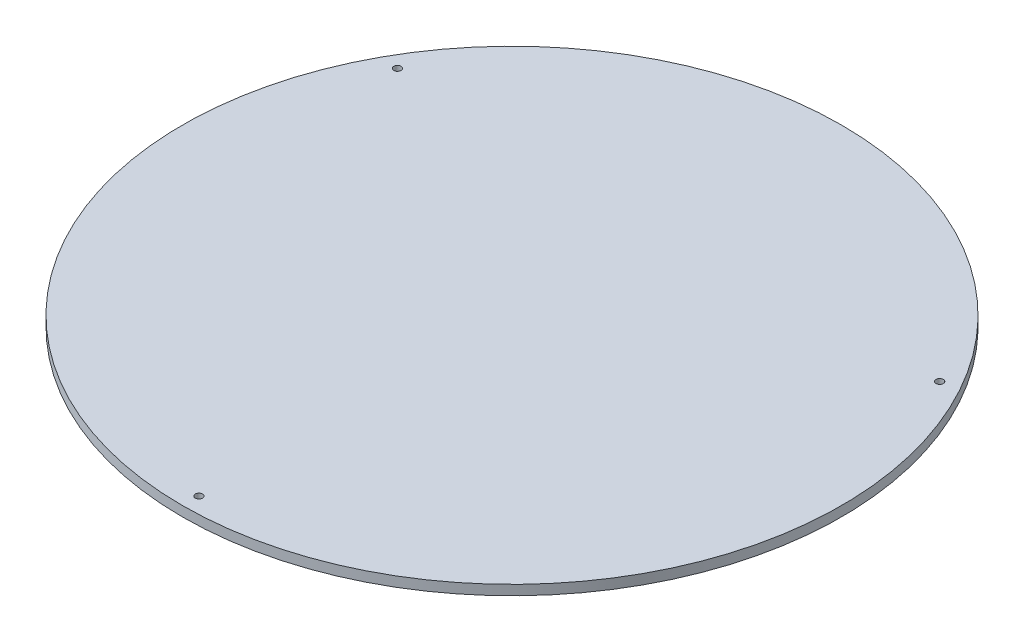
ISO-10303-21;
HEADER;
FILE_DESCRIPTION(('STEP AP214'),'2;1');
FILE_NAME('part.step','',(''),(''),'','','');
FILE_SCHEMA(('AUTOMOTIVE_DESIGN { 1 0 10303 214 1 1 1 1 }'));
ENDSEC;
DATA;
#1=APPLICATION_CONTEXT('core data for automotive mechanical design processes');
#2=APPLICATION_PROTOCOL_DEFINITION('international standard','automotive_design',2000,#1);
#3=PRODUCT_CONTEXT('',#1,'mechanical');
#4=PRODUCT('Part','Part','',(#3));
#5=PRODUCT_RELATED_PRODUCT_CATEGORY('part','',(#4));
#6=PRODUCT_DEFINITION_FORMATION('','',#4);
#7=PRODUCT_DEFINITION_CONTEXT('part definition',#1,'design');
#8=PRODUCT_DEFINITION('design','',#6,#7);
#9=PRODUCT_DEFINITION_SHAPE('','',#8);
#10=(LENGTH_UNIT() NAMED_UNIT(*) SI_UNIT(.MILLI.,.METRE.));
#11=(NAMED_UNIT(*) PLANE_ANGLE_UNIT() SI_UNIT($,.RADIAN.));
#12=(NAMED_UNIT(*) SI_UNIT($,.STERADIAN.) SOLID_ANGLE_UNIT());
#13=UNCERTAINTY_MEASURE_WITH_UNIT(LENGTH_MEASURE(1.E-05),#10,'distance_accuracy_value','');
#14=(GEOMETRIC_REPRESENTATION_CONTEXT(3) GLOBAL_UNCERTAINTY_ASSIGNED_CONTEXT((#13)) GLOBAL_UNIT_ASSIGNED_CONTEXT((#10,
#11,#12)) REPRESENTATION_CONTEXT('',''));
#15=CARTESIAN_POINT('',(0.,0.,0.));
#16=DIRECTION('',(0.,0.,1.));
#17=DIRECTION('',(1.,0.,0.));
#18=AXIS2_PLACEMENT_3D('',#15,#16,#17);
#19=CARTESIAN_POINT('',(0.,3.,0.));
#20=DIRECTION('',(0.,-1.,0.));
#21=DIRECTION('',(0.,0.,-1.));
#22=AXIS2_PLACEMENT_3D('',#19,#20,#21);
#23=CYLINDRICAL_SURFACE('',#22,100.);
#24=CARTESIAN_POINT('',(0.,3.,0.));
#25=DIRECTION('',(0.,1.,0.));
#26=DIRECTION('',(0.,0.,1.));
#27=AXIS2_PLACEMENT_3D('',#24,#25,#26);
#28=CIRCLE('',#27,100.);
#29=CARTESIAN_POINT('',(0.,3.,100.));
#30=VERTEX_POINT('',#29);
#31=EDGE_CURVE('E10',#30,#30,#28,.T.);
#32=ORIENTED_EDGE('',*,*,#31,.F.);
#33=EDGE_LOOP('',(#32));
#34=FACE_BOUND('',#33,.T.);
#35=CARTESIAN_POINT('',(0.,0.,0.));
#36=DIRECTION('',(0.,1.,0.));
#37=DIRECTION('',(0.,0.,1.));
#38=AXIS2_PLACEMENT_3D('',#35,#36,#37);
#39=CIRCLE('',#38,100.);
#40=CARTESIAN_POINT('',(0.,0.,100.));
#41=VERTEX_POINT('',#40);
#42=EDGE_CURVE('E43',#41,#41,#39,.T.);
#43=ORIENTED_EDGE('',*,*,#42,.T.);
#44=EDGE_LOOP('',(#43));
#45=FACE_BOUND('',#44,.T.);
#46=ADVANCED_FACE('F40',(#34,#45),#23,.T.);
#47=CARTESIAN_POINT('',(0.,3.,0.));
#48=DIRECTION('',(0.,1.,0.));
#49=DIRECTION('',(0.,0.,1.));
#50=AXIS2_PLACEMENT_3D('',#47,#48,#49);
#51=PLANE('',#50);
#52=CARTESIAN_POINT('',(0.,3.,95.));
#53=DIRECTION('',(0.,1.,0.));
#54=DIRECTION('',(0.,0.,1.));
#55=AXIS2_PLACEMENT_3D('',#52,#53,#54);
#56=CIRCLE('',#55,1.1);
#57=CARTESIAN_POINT('',(0.,3.,96.1));
#58=VERTEX_POINT('',#57);
#59=EDGE_CURVE('E67',#58,#58,#56,.T.);
#60=ORIENTED_EDGE('',*,*,#59,.F.);
#61=EDGE_LOOP('',(#60));
#62=FACE_BOUND('',#61,.T.);
#63=CARTESIAN_POINT('',(-82.2724133595215,3.,-47.5000000000004));
#64=DIRECTION('',(0.,1.,0.));
#65=DIRECTION('',(0.,0.,1.));
#66=AXIS2_PLACEMENT_3D('',#63,#64,#65);
#67=CIRCLE('',#66,1.1);
#68=CARTESIAN_POINT('',(-82.2724133595215,3.,-46.4000000000004));
#69=VERTEX_POINT('',#68);
#70=EDGE_CURVE('E63',#69,#69,#67,.T.);
#71=ORIENTED_EDGE('',*,*,#70,.F.);
#72=EDGE_LOOP('',(#71));
#73=FACE_BOUND('',#72,.T.);
#74=CARTESIAN_POINT('',(82.2724133595221,3.,-47.4999999999992));
#75=DIRECTION('',(0.,1.,0.));
#76=DIRECTION('',(0.,0.,1.));
#77=AXIS2_PLACEMENT_3D('',#74,#75,#76);
#78=CIRCLE('',#77,1.1);
#79=CARTESIAN_POINT('',(82.2724133595221,3.,-46.3999999999992));
#80=VERTEX_POINT('',#79);
#81=EDGE_CURVE('E54',#80,#80,#78,.T.);
#82=ORIENTED_EDGE('',*,*,#81,.F.);
#83=EDGE_LOOP('',(#82));
#84=FACE_BOUND('',#83,.T.);
#85=ORIENTED_EDGE('',*,*,#31,.T.);
#86=EDGE_LOOP('',(#85));
#87=FACE_BOUND('',#86,.T.);
#88=ADVANCED_FACE('F81',(#62,#73,#84,#87),#51,.T.);
#89=CARTESIAN_POINT('',(0.,0.,0.));
#90=DIRECTION('',(0.,1.,0.));
#91=DIRECTION('',(0.,0.,1.));
#92=AXIS2_PLACEMENT_3D('',#89,#90,#91);
#93=PLANE('',#92);
#94=CARTESIAN_POINT('',(0.,0.,95.));
#95=DIRECTION('',(0.,1.,0.));
#96=DIRECTION('',(0.,0.,1.));
#97=AXIS2_PLACEMENT_3D('',#94,#95,#96);
#98=CIRCLE('',#97,1.1);
#99=CARTESIAN_POINT('',(0.,0.,96.1));
#100=VERTEX_POINT('',#99);
#101=EDGE_CURVE('E52',#100,#100,#98,.F.);
#102=ORIENTED_EDGE('',*,*,#101,.F.);
#103=EDGE_LOOP('',(#102));
#104=FACE_BOUND('',#103,.T.);
#105=CARTESIAN_POINT('',(-82.2724133595215,0.,-47.5000000000004));
#106=DIRECTION('',(0.,1.,0.));
#107=DIRECTION('',(0.,0.,1.));
#108=AXIS2_PLACEMENT_3D('',#105,#106,#107);
#109=CIRCLE('',#108,1.1);
#110=CARTESIAN_POINT('',(-82.2724133595215,0.,-46.4000000000004));
#111=VERTEX_POINT('',#110);
#112=EDGE_CURVE('E58',#111,#111,#109,.F.);
#113=ORIENTED_EDGE('',*,*,#112,.F.);
#114=EDGE_LOOP('',(#113));
#115=FACE_BOUND('',#114,.T.);
#116=CARTESIAN_POINT('',(82.2724133595221,0.,-47.4999999999992));
#117=DIRECTION('',(0.,1.,0.));
#118=DIRECTION('',(0.,0.,1.));
#119=AXIS2_PLACEMENT_3D('',#116,#117,#118);
#120=CIRCLE('',#119,1.1);
#121=CARTESIAN_POINT('',(82.2724133595221,0.,-46.3999999999992));
#122=VERTEX_POINT('',#121);
#123=EDGE_CURVE('E59',#122,#122,#120,.F.);
#124=ORIENTED_EDGE('',*,*,#123,.F.);
#125=EDGE_LOOP('',(#124));
#126=FACE_BOUND('',#125,.T.);
#127=ORIENTED_EDGE('',*,*,#42,.F.);
#128=EDGE_LOOP('',(#127));
#129=FACE_BOUND('',#128,.T.);
#130=ADVANCED_FACE('F84',(#104,#115,#126,#129),#93,.F.);
#131=CARTESIAN_POINT('',(82.2724133595221,-0.00100000000000013,-47.4999999999992));
#132=DIRECTION('',(0.,1.,0.));
#133=DIRECTION('',(0.,0.,1.));
#134=AXIS2_PLACEMENT_3D('',#131,#132,#133);
#135=CYLINDRICAL_SURFACE('',#134,1.1);
#136=CARTESIAN_POINT('',(82.2724133595221,3.,-46.3999999999992));
#137=CARTESIAN_POINT('',(82.2724133595221,2.96875,-46.3999999999992));
#138=CARTESIAN_POINT('',(82.2724133595221,2.9375,-46.3999999999992));
#139=CARTESIAN_POINT('',(82.2724133595221,2.875,-46.3999999999992));
#140=CARTESIAN_POINT('',(82.2724133595221,2.84375,-46.3999999999992));
#141=CARTESIAN_POINT('',(82.2724133595221,2.78125,-46.3999999999992));
#142=CARTESIAN_POINT('',(82.2724133595221,2.75,-46.3999999999992));
#143=CARTESIAN_POINT('',(82.2724133595221,2.6875,-46.3999999999992));
#144=CARTESIAN_POINT('',(82.2724133595221,2.65625,-46.3999999999992));
#145=CARTESIAN_POINT('',(82.2724133595221,2.59375,-46.3999999999992));
#146=CARTESIAN_POINT('',(82.2724133595221,2.5625,-46.3999999999992));
#147=CARTESIAN_POINT('',(82.2724133595221,2.5,-46.3999999999992));
#148=CARTESIAN_POINT('',(82.2724133595221,2.46875,-46.3999999999992));
#149=CARTESIAN_POINT('',(82.2724133595221,2.40625,-46.3999999999992));
#150=CARTESIAN_POINT('',(82.2724133595221,2.375,-46.3999999999992));
#151=CARTESIAN_POINT('',(82.2724133595221,2.3125,-46.3999999999992));
#152=CARTESIAN_POINT('',(82.2724133595221,2.28125,-46.3999999999992));
#153=CARTESIAN_POINT('',(82.2724133595221,2.21875,-46.3999999999992));
#154=CARTESIAN_POINT('',(82.2724133595221,2.1875,-46.3999999999992));
#155=CARTESIAN_POINT('',(82.2724133595221,2.125,-46.3999999999992));
#156=CARTESIAN_POINT('',(82.2724133595221,2.09375,-46.3999999999992));
#157=CARTESIAN_POINT('',(82.2724133595221,2.03125,-46.3999999999992));
#158=CARTESIAN_POINT('',(82.2724133595221,2.,-46.3999999999992));
#159=CARTESIAN_POINT('',(82.2724133595221,1.9375,-46.3999999999992));
#160=CARTESIAN_POINT('',(82.2724133595221,1.90625,-46.3999999999992));
#161=CARTESIAN_POINT('',(82.2724133595221,1.84375,-46.3999999999992));
#162=CARTESIAN_POINT('',(82.2724133595221,1.8125,-46.3999999999992));
#163=CARTESIAN_POINT('',(82.2724133595221,1.75,-46.3999999999992));
#164=CARTESIAN_POINT('',(82.2724133595221,1.71875,-46.3999999999992));
#165=CARTESIAN_POINT('',(82.2724133595221,1.65625,-46.3999999999992));
#166=CARTESIAN_POINT('',(82.2724133595221,1.625,-46.3999999999992));
#167=CARTESIAN_POINT('',(82.2724133595221,1.5625,-46.3999999999992));
#168=CARTESIAN_POINT('',(82.2724133595221,1.53125,-46.3999999999992));
#169=CARTESIAN_POINT('',(82.2724133595221,1.46875,-46.3999999999992));
#170=CARTESIAN_POINT('',(82.2724133595221,1.4375,-46.3999999999992));
#171=CARTESIAN_POINT('',(82.2724133595221,1.375,-46.3999999999992));
#172=CARTESIAN_POINT('',(82.2724133595221,1.34375,-46.3999999999992));
#173=CARTESIAN_POINT('',(82.2724133595221,1.28125,-46.3999999999992));
#174=CARTESIAN_POINT('',(82.2724133595221,1.25,-46.3999999999992));
#175=CARTESIAN_POINT('',(82.2724133595221,1.1875,-46.3999999999992));
#176=CARTESIAN_POINT('',(82.2724133595221,1.15625,-46.3999999999992));
#177=CARTESIAN_POINT('',(82.2724133595221,1.09375,-46.3999999999992));
#178=CARTESIAN_POINT('',(82.2724133595221,1.0625,-46.3999999999992));
#179=CARTESIAN_POINT('',(82.2724133595221,1.,-46.3999999999992));
#180=CARTESIAN_POINT('',(82.2724133595221,0.96875,-46.3999999999992));
#181=CARTESIAN_POINT('',(82.2724133595221,0.90625,-46.3999999999992));
#182=CARTESIAN_POINT('',(82.2724133595221,0.875,-46.3999999999992));
#183=CARTESIAN_POINT('',(82.2724133595221,0.8125,-46.3999999999992));
#184=CARTESIAN_POINT('',(82.2724133595221,0.78125,-46.3999999999992));
#185=CARTESIAN_POINT('',(82.2724133595221,0.71875,-46.3999999999992));
#186=CARTESIAN_POINT('',(82.2724133595221,0.6875,-46.3999999999992));
#187=CARTESIAN_POINT('',(82.2724133595221,0.625,-46.3999999999992));
#188=CARTESIAN_POINT('',(82.2724133595221,0.59375,-46.3999999999992));
#189=CARTESIAN_POINT('',(82.2724133595221,0.53125,-46.3999999999992));
#190=CARTESIAN_POINT('',(82.2724133595221,0.5,-46.3999999999992));
#191=CARTESIAN_POINT('',(82.2724133595221,0.4375,-46.3999999999992));
#192=CARTESIAN_POINT('',(82.2724133595221,0.40625,-46.3999999999992));
#193=CARTESIAN_POINT('',(82.2724133595221,0.34375,-46.3999999999992));
#194=CARTESIAN_POINT('',(82.2724133595221,0.3125,-46.3999999999992));
#195=CARTESIAN_POINT('',(82.2724133595221,0.25,-46.3999999999992));
#196=CARTESIAN_POINT('',(82.2724133595221,0.21875,-46.3999999999992));
#197=CARTESIAN_POINT('',(82.2724133595221,0.15625,-46.3999999999992));
#198=CARTESIAN_POINT('',(82.2724133595221,0.125,-46.3999999999992));
#199=CARTESIAN_POINT('',(82.2724133595221,0.0625000000000001,-46.3999999999992));
#200=CARTESIAN_POINT('',(82.2724133595221,0.0312500000000001,-46.3999999999992));
#201=CARTESIAN_POINT('',(82.2724133595221,0.,-46.3999999999992));
#202=B_SPLINE_CURVE_WITH_KNOTS('',3,(#136,#137,#138,#139,#140,#141,#142,#143,#144,#145,#146,
#147,#148,#149,#150,#151,#152,#153,#154,#155,#156,#157,#158,#159,#160,#161,#162,#163,#164,#165,
#166,#167,#168,#169,#170,#171,#172,#173,#174,#175,#176,#177,#178,#179,#180,#181,#182,#183,#184,
#185,#186,#187,#188,#189,#190,#191,#192,#193,#194,#195,#196,#197,#198,#199,#200,#201),
.UNSPECIFIED.,.F.,.F.,(4,2,2,2,2,2,2,2,2,2,2,2,2,2,2,2,2,2,2,2,2,2,2,2,2,2,2,2,2,2,2,2,4),(0.,
0.0937500000000001,0.1875,0.28125,0.375,0.46875,0.5625,0.65625,0.75,0.84375,0.9375,1.03125,
1.125,1.21875,1.3125,1.40625,1.5,1.59375,1.6875,1.78125,1.875,1.96875,2.0625,2.15625,2.25,
2.34375,2.4375,2.53125,2.625,2.71875,2.8125,2.90625,3.),.UNSPECIFIED.);
#203=EDGE_CURVE('BSEAM90',#80,#122,#202,.T.);
#204=ORIENTED_EDGE('',*,*,#81,.T.);
#205=ORIENTED_EDGE('',*,*,#123,.T.);
#206=ORIENTED_EDGE('',*,*,#203,.T.);
#207=ORIENTED_EDGE('',*,*,#203,.F.);
#208=EDGE_LOOP('',(#204,#206,#205,#207));
#209=FACE_BOUND('',#208,.T.);
#210=ADVANCED_FACE('F90',(#209),#135,.F.);
#211=CARTESIAN_POINT('',(-82.2724133595215,-0.00100000000000013,-47.5000000000004));
#212=DIRECTION('',(0.,1.,0.));
#213=DIRECTION('',(0.,0.,1.));
#214=AXIS2_PLACEMENT_3D('',#211,#212,#213);
#215=CYLINDRICAL_SURFACE('',#214,1.1);
#216=CARTESIAN_POINT('',(-82.2724133595215,3.,-46.4000000000004));
#217=CARTESIAN_POINT('',(-82.2724133595215,2.96875,-46.4000000000004));
#218=CARTESIAN_POINT('',(-82.2724133595215,2.9375,-46.4000000000004));
#219=CARTESIAN_POINT('',(-82.2724133595215,2.875,-46.4000000000004));
#220=CARTESIAN_POINT('',(-82.2724133595215,2.84375,-46.4000000000004));
#221=CARTESIAN_POINT('',(-82.2724133595215,2.78125,-46.4000000000004));
#222=CARTESIAN_POINT('',(-82.2724133595215,2.75,-46.4000000000004));
#223=CARTESIAN_POINT('',(-82.2724133595215,2.6875,-46.4000000000004));
#224=CARTESIAN_POINT('',(-82.2724133595215,2.65625,-46.4000000000004));
#225=CARTESIAN_POINT('',(-82.2724133595215,2.59375,-46.4000000000004));
#226=CARTESIAN_POINT('',(-82.2724133595215,2.5625,-46.4000000000004));
#227=CARTESIAN_POINT('',(-82.2724133595215,2.5,-46.4000000000004));
#228=CARTESIAN_POINT('',(-82.2724133595215,2.46875,-46.4000000000004));
#229=CARTESIAN_POINT('',(-82.2724133595215,2.40625,-46.4000000000004));
#230=CARTESIAN_POINT('',(-82.2724133595215,2.375,-46.4000000000004));
#231=CARTESIAN_POINT('',(-82.2724133595215,2.3125,-46.4000000000004));
#232=CARTESIAN_POINT('',(-82.2724133595215,2.28125,-46.4000000000004));
#233=CARTESIAN_POINT('',(-82.2724133595215,2.21875,-46.4000000000004));
#234=CARTESIAN_POINT('',(-82.2724133595215,2.1875,-46.4000000000004));
#235=CARTESIAN_POINT('',(-82.2724133595215,2.125,-46.4000000000004));
#236=CARTESIAN_POINT('',(-82.2724133595215,2.09375,-46.4000000000004));
#237=CARTESIAN_POINT('',(-82.2724133595215,2.03125,-46.4000000000004));
#238=CARTESIAN_POINT('',(-82.2724133595215,2.,-46.4000000000004));
#239=CARTESIAN_POINT('',(-82.2724133595215,1.9375,-46.4000000000004));
#240=CARTESIAN_POINT('',(-82.2724133595215,1.90625,-46.4000000000004));
#241=CARTESIAN_POINT('',(-82.2724133595215,1.84375,-46.4000000000004));
#242=CARTESIAN_POINT('',(-82.2724133595215,1.8125,-46.4000000000004));
#243=CARTESIAN_POINT('',(-82.2724133595215,1.75,-46.4000000000004));
#244=CARTESIAN_POINT('',(-82.2724133595215,1.71875,-46.4000000000004));
#245=CARTESIAN_POINT('',(-82.2724133595215,1.65625,-46.4000000000004));
#246=CARTESIAN_POINT('',(-82.2724133595215,1.625,-46.4000000000004));
#247=CARTESIAN_POINT('',(-82.2724133595215,1.5625,-46.4000000000004));
#248=CARTESIAN_POINT('',(-82.2724133595215,1.53125,-46.4000000000004));
#249=CARTESIAN_POINT('',(-82.2724133595215,1.46875,-46.4000000000004));
#250=CARTESIAN_POINT('',(-82.2724133595215,1.4375,-46.4000000000004));
#251=CARTESIAN_POINT('',(-82.2724133595215,1.375,-46.4000000000004));
#252=CARTESIAN_POINT('',(-82.2724133595215,1.34375,-46.4000000000004));
#253=CARTESIAN_POINT('',(-82.2724133595215,1.28125,-46.4000000000004));
#254=CARTESIAN_POINT('',(-82.2724133595215,1.25,-46.4000000000004));
#255=CARTESIAN_POINT('',(-82.2724133595215,1.1875,-46.4000000000004));
#256=CARTESIAN_POINT('',(-82.2724133595215,1.15625,-46.4000000000004));
#257=CARTESIAN_POINT('',(-82.2724133595215,1.09375,-46.4000000000004));
#258=CARTESIAN_POINT('',(-82.2724133595215,1.0625,-46.4000000000004));
#259=CARTESIAN_POINT('',(-82.2724133595215,1.,-46.4000000000004));
#260=CARTESIAN_POINT('',(-82.2724133595215,0.96875,-46.4000000000004));
#261=CARTESIAN_POINT('',(-82.2724133595215,0.90625,-46.4000000000004));
#262=CARTESIAN_POINT('',(-82.2724133595215,0.875,-46.4000000000004));
#263=CARTESIAN_POINT('',(-82.2724133595215,0.8125,-46.4000000000004));
#264=CARTESIAN_POINT('',(-82.2724133595215,0.78125,-46.4000000000004));
#265=CARTESIAN_POINT('',(-82.2724133595215,0.71875,-46.4000000000004));
#266=CARTESIAN_POINT('',(-82.2724133595215,0.6875,-46.4000000000004));
#267=CARTESIAN_POINT('',(-82.2724133595215,0.625,-46.4000000000004));
#268=CARTESIAN_POINT('',(-82.2724133595215,0.59375,-46.4000000000004));
#269=CARTESIAN_POINT('',(-82.2724133595215,0.53125,-46.4000000000004));
#270=CARTESIAN_POINT('',(-82.2724133595215,0.5,-46.4000000000004));
#271=CARTESIAN_POINT('',(-82.2724133595215,0.4375,-46.4000000000004));
#272=CARTESIAN_POINT('',(-82.2724133595215,0.40625,-46.4000000000004));
#273=CARTESIAN_POINT('',(-82.2724133595215,0.34375,-46.4000000000004));
#274=CARTESIAN_POINT('',(-82.2724133595215,0.3125,-46.4000000000004));
#275=CARTESIAN_POINT('',(-82.2724133595215,0.25,-46.4000000000004));
#276=CARTESIAN_POINT('',(-82.2724133595215,0.21875,-46.4000000000004));
#277=CARTESIAN_POINT('',(-82.2724133595215,0.15625,-46.4000000000004));
#278=CARTESIAN_POINT('',(-82.2724133595215,0.125,-46.4000000000004));
#279=CARTESIAN_POINT('',(-82.2724133595215,0.0625000000000001,-46.4000000000004));
#280=CARTESIAN_POINT('',(-82.2724133595215,0.0312500000000001,-46.4000000000004));
#281=CARTESIAN_POINT('',(-82.2724133595215,0.,-46.4000000000004));
#282=B_SPLINE_CURVE_WITH_KNOTS('',3,(#216,#217,#218,#219,#220,#221,#222,#223,#224,#225,#226,
#227,#228,#229,#230,#231,#232,#233,#234,#235,#236,#237,#238,#239,#240,#241,#242,#243,#244,#245,
#246,#247,#248,#249,#250,#251,#252,#253,#254,#255,#256,#257,#258,#259,#260,#261,#262,#263,#264,
#265,#266,#267,#268,#269,#270,#271,#272,#273,#274,#275,#276,#277,#278,#279,#280,#281),
.UNSPECIFIED.,.F.,.F.,(4,2,2,2,2,2,2,2,2,2,2,2,2,2,2,2,2,2,2,2,2,2,2,2,2,2,2,2,2,2,2,2,4),(0.,
0.0937500000000001,0.1875,0.28125,0.375,0.46875,0.5625,0.65625,0.75,0.84375,0.9375,1.03125,
1.125,1.21875,1.3125,1.40625,1.5,1.59375,1.6875,1.78125,1.875,1.96875,2.0625,2.15625,2.25,
2.34375,2.4375,2.53125,2.625,2.71875,2.8125,2.90625,3.),.UNSPECIFIED.);
#283=EDGE_CURVE('BSEAM93',#69,#111,#282,.T.);
#284=ORIENTED_EDGE('',*,*,#70,.T.);
#285=ORIENTED_EDGE('',*,*,#112,.T.);
#286=ORIENTED_EDGE('',*,*,#283,.T.);
#287=ORIENTED_EDGE('',*,*,#283,.F.);
#288=EDGE_LOOP('',(#284,#286,#285,#287));
#289=FACE_BOUND('',#288,.T.);
#290=ADVANCED_FACE('F93',(#289),#215,.F.);
#291=CARTESIAN_POINT('',(0.,-0.00100000000000013,95.));
#292=DIRECTION('',(0.,1.,0.));
#293=DIRECTION('',(0.,0.,1.));
#294=AXIS2_PLACEMENT_3D('',#291,#292,#293);
#295=CYLINDRICAL_SURFACE('',#294,1.1);
#296=CARTESIAN_POINT('',(0.,3.,96.1));
#297=CARTESIAN_POINT('',(0.,2.96875,96.1));
#298=CARTESIAN_POINT('',(0.,2.9375,96.1));
#299=CARTESIAN_POINT('',(0.,2.875,96.1));
#300=CARTESIAN_POINT('',(0.,2.84375,96.1));
#301=CARTESIAN_POINT('',(0.,2.78125,96.1));
#302=CARTESIAN_POINT('',(0.,2.75,96.1));
#303=CARTESIAN_POINT('',(0.,2.6875,96.1));
#304=CARTESIAN_POINT('',(0.,2.65625,96.1));
#305=CARTESIAN_POINT('',(0.,2.59375,96.1));
#306=CARTESIAN_POINT('',(0.,2.5625,96.1));
#307=CARTESIAN_POINT('',(0.,2.5,96.1));
#308=CARTESIAN_POINT('',(0.,2.46875,96.1));
#309=CARTESIAN_POINT('',(0.,2.40625,96.1));
#310=CARTESIAN_POINT('',(0.,2.375,96.1));
#311=CARTESIAN_POINT('',(0.,2.3125,96.1));
#312=CARTESIAN_POINT('',(0.,2.28125,96.1));
#313=CARTESIAN_POINT('',(0.,2.21875,96.1));
#314=CARTESIAN_POINT('',(0.,2.1875,96.1));
#315=CARTESIAN_POINT('',(0.,2.125,96.1));
#316=CARTESIAN_POINT('',(0.,2.09375,96.1));
#317=CARTESIAN_POINT('',(0.,2.03125,96.1));
#318=CARTESIAN_POINT('',(0.,2.,96.1));
#319=CARTESIAN_POINT('',(0.,1.9375,96.1));
#320=CARTESIAN_POINT('',(0.,1.90625,96.1));
#321=CARTESIAN_POINT('',(0.,1.84375,96.1));
#322=CARTESIAN_POINT('',(0.,1.8125,96.1));
#323=CARTESIAN_POINT('',(0.,1.75,96.1));
#324=CARTESIAN_POINT('',(0.,1.71875,96.1));
#325=CARTESIAN_POINT('',(0.,1.65625,96.1));
#326=CARTESIAN_POINT('',(0.,1.625,96.1));
#327=CARTESIAN_POINT('',(0.,1.5625,96.1));
#328=CARTESIAN_POINT('',(0.,1.53125,96.1));
#329=CARTESIAN_POINT('',(0.,1.46875,96.1));
#330=CARTESIAN_POINT('',(0.,1.4375,96.1));
#331=CARTESIAN_POINT('',(0.,1.375,96.1));
#332=CARTESIAN_POINT('',(0.,1.34375,96.1));
#333=CARTESIAN_POINT('',(0.,1.28125,96.1));
#334=CARTESIAN_POINT('',(0.,1.25,96.1));
#335=CARTESIAN_POINT('',(0.,1.1875,96.1));
#336=CARTESIAN_POINT('',(0.,1.15625,96.1));
#337=CARTESIAN_POINT('',(0.,1.09375,96.1));
#338=CARTESIAN_POINT('',(0.,1.0625,96.1));
#339=CARTESIAN_POINT('',(0.,1.,96.1));
#340=CARTESIAN_POINT('',(0.,0.96875,96.1));
#341=CARTESIAN_POINT('',(0.,0.90625,96.1));
#342=CARTESIAN_POINT('',(0.,0.875,96.1));
#343=CARTESIAN_POINT('',(0.,0.8125,96.1));
#344=CARTESIAN_POINT('',(0.,0.78125,96.1));
#345=CARTESIAN_POINT('',(0.,0.71875,96.1));
#346=CARTESIAN_POINT('',(0.,0.6875,96.1));
#347=CARTESIAN_POINT('',(0.,0.625,96.1));
#348=CARTESIAN_POINT('',(0.,0.59375,96.1));
#349=CARTESIAN_POINT('',(0.,0.53125,96.1));
#350=CARTESIAN_POINT('',(0.,0.5,96.1));
#351=CARTESIAN_POINT('',(0.,0.4375,96.1));
#352=CARTESIAN_POINT('',(0.,0.40625,96.1));
#353=CARTESIAN_POINT('',(0.,0.34375,96.1));
#354=CARTESIAN_POINT('',(0.,0.3125,96.1));
#355=CARTESIAN_POINT('',(0.,0.25,96.1));
#356=CARTESIAN_POINT('',(0.,0.21875,96.1));
#357=CARTESIAN_POINT('',(0.,0.15625,96.1));
#358=CARTESIAN_POINT('',(0.,0.125,96.1));
#359=CARTESIAN_POINT('',(0.,0.0625000000000001,96.1));
#360=CARTESIAN_POINT('',(0.,0.0312500000000001,96.1));
#361=CARTESIAN_POINT('',(0.,0.,96.1));
#362=B_SPLINE_CURVE_WITH_KNOTS('',3,(#296,#297,#298,#299,#300,#301,#302,#303,#304,#305,#306,
#307,#308,#309,#310,#311,#312,#313,#314,#315,#316,#317,#318,#319,#320,#321,#322,#323,#324,#325,
#326,#327,#328,#329,#330,#331,#332,#333,#334,#335,#336,#337,#338,#339,#340,#341,#342,#343,#344,
#345,#346,#347,#348,#349,#350,#351,#352,#353,#354,#355,#356,#357,#358,#359,#360,#361),
.UNSPECIFIED.,.F.,.F.,(4,2,2,2,2,2,2,2,2,2,2,2,2,2,2,2,2,2,2,2,2,2,2,2,2,2,2,2,2,2,2,2,4),(0.,
0.0937500000000001,0.1875,0.28125,0.375,0.46875,0.5625,0.65625,0.75,0.84375,0.9375,1.03125,
1.125,1.21875,1.3125,1.40625,1.5,1.59375,1.6875,1.78125,1.875,1.96875,2.0625,2.15625,2.25,
2.34375,2.4375,2.53125,2.625,2.71875,2.8125,2.90625,3.),.UNSPECIFIED.);
#363=EDGE_CURVE('BSEAM78',#58,#100,#362,.T.);
#364=ORIENTED_EDGE('',*,*,#59,.T.);
#365=ORIENTED_EDGE('',*,*,#101,.T.);
#366=ORIENTED_EDGE('',*,*,#363,.T.);
#367=ORIENTED_EDGE('',*,*,#363,.F.);
#368=EDGE_LOOP('',(#364,#366,#365,#367));
#369=FACE_BOUND('',#368,.T.);
#370=ADVANCED_FACE('F78',(#369),#295,.F.);
#371=CLOSED_SHELL('',(#46,#88,#130,#210,#290,#370));
#372=MANIFOLD_SOLID_BREP('B2',#371);
#373=ADVANCED_BREP_SHAPE_REPRESENTATION('',(#18,#372),#14);
#374=SHAPE_DEFINITION_REPRESENTATION(#9,#373);
ENDSEC;
END-ISO-10303-21;
